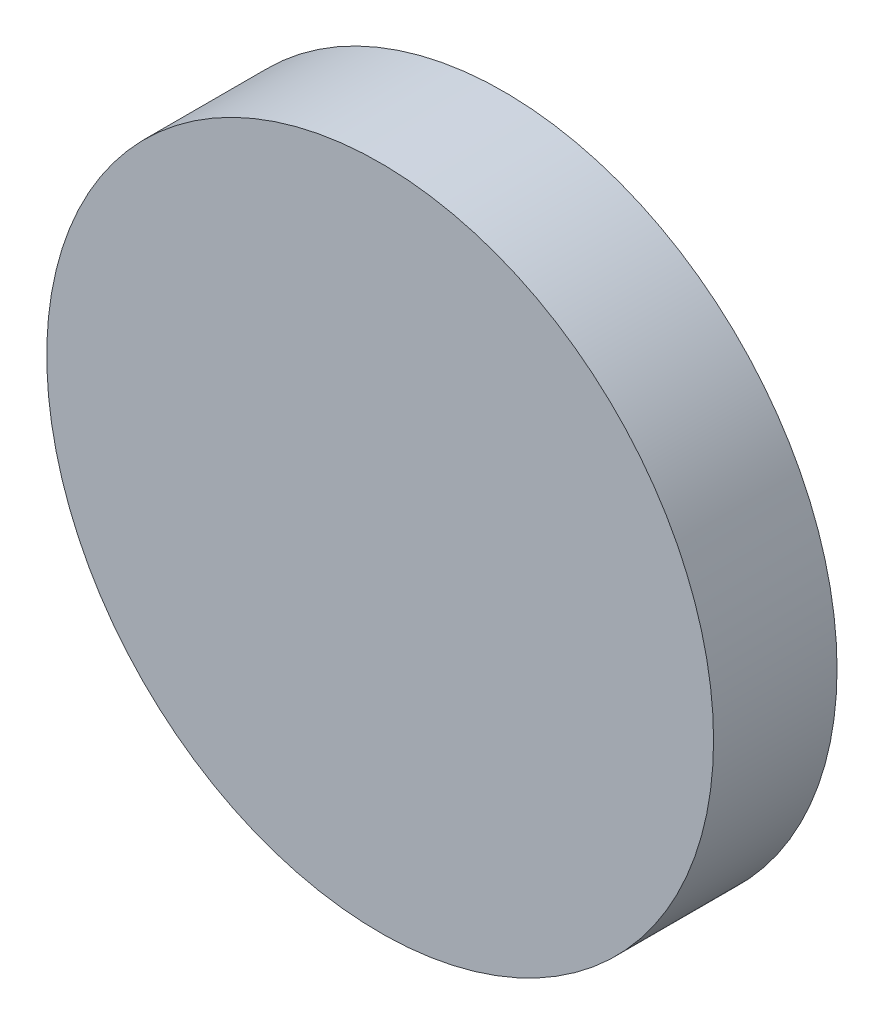
ISO-10303-21;
HEADER;
FILE_DESCRIPTION(('STEP AP214'),'2;1');
FILE_NAME('part.step','',(''),(''),'','','');
FILE_SCHEMA(('AUTOMOTIVE_DESIGN { 1 0 10303 214 1 1 1 1 }'));
ENDSEC;
DATA;
#1=APPLICATION_CONTEXT('core data for automotive mechanical design processes');
#2=APPLICATION_PROTOCOL_DEFINITION('international standard','automotive_design',2000,#1);
#3=PRODUCT_CONTEXT('',#1,'mechanical');
#4=PRODUCT('Part','Part','',(#3));
#5=PRODUCT_RELATED_PRODUCT_CATEGORY('part','',(#4));
#6=PRODUCT_DEFINITION_FORMATION('','',#4);
#7=PRODUCT_DEFINITION_CONTEXT('part definition',#1,'design');
#8=PRODUCT_DEFINITION('design','',#6,#7);
#9=PRODUCT_DEFINITION_SHAPE('','',#8);
#10=(LENGTH_UNIT() NAMED_UNIT(*) SI_UNIT(.MILLI.,.METRE.));
#11=(NAMED_UNIT(*) PLANE_ANGLE_UNIT() SI_UNIT($,.RADIAN.));
#12=(NAMED_UNIT(*) SI_UNIT($,.STERADIAN.) SOLID_ANGLE_UNIT());
#13=UNCERTAINTY_MEASURE_WITH_UNIT(LENGTH_MEASURE(1.E-05),#10,'distance_accuracy_value','');
#14=(GEOMETRIC_REPRESENTATION_CONTEXT(3) GLOBAL_UNCERTAINTY_ASSIGNED_CONTEXT((#13)) GLOBAL_UNIT_ASSIGNED_CONTEXT((#10,
#11,#12)) REPRESENTATION_CONTEXT('',''));
#15=CARTESIAN_POINT('',(0.,0.,0.));
#16=DIRECTION('',(0.,0.,1.));
#17=DIRECTION('',(1.,0.,0.));
#18=AXIS2_PLACEMENT_3D('',#15,#16,#17);
#19=CARTESIAN_POINT('',(0.,0.,5.));
#20=DIRECTION('',(0.,0.,-1.));
#21=DIRECTION('',(-1.,0.,0.));
#22=AXIS2_PLACEMENT_3D('',#19,#20,#21);
#23=CYLINDRICAL_SURFACE('',#22,27.);
#24=CARTESIAN_POINT('',(0.,0.,5.));
#25=DIRECTION('',(0.,0.,1.));
#26=DIRECTION('',(1.,0.,0.));
#27=AXIS2_PLACEMENT_3D('',#24,#25,#26);
#28=CIRCLE('',#27,27.);
#29=CARTESIAN_POINT('',(27.,0.,5.));
#30=VERTEX_POINT('',#29);
#31=EDGE_CURVE('E57',#30,#30,#28,.T.);
#32=ORIENTED_EDGE('',*,*,#31,.F.);
#33=EDGE_LOOP('',(#32));
#34=FACE_BOUND('',#33,.T.);
#35=CARTESIAN_POINT('',(0.,0.,-5.));
#36=DIRECTION('',(0.,0.,1.));
#37=DIRECTION('',(1.,0.,0.));
#38=AXIS2_PLACEMENT_3D('',#35,#36,#37);
#39=CIRCLE('',#38,27.);
#40=CARTESIAN_POINT('',(27.,0.,-5.));
#41=VERTEX_POINT('',#40);
#42=EDGE_CURVE('E49',#41,#41,#39,.T.);
#43=ORIENTED_EDGE('',*,*,#42,.T.);
#44=EDGE_LOOP('',(#43));
#45=FACE_BOUND('',#44,.T.);
#46=ADVANCED_FACE('F50',(#34,#45),#23,.T.);
#47=CARTESIAN_POINT('',(0.,0.,5.));
#48=DIRECTION('',(0.,0.,1.));
#49=DIRECTION('',(1.,0.,0.));
#50=AXIS2_PLACEMENT_3D('',#47,#48,#49);
#51=PLANE('',#50);
#52=ORIENTED_EDGE('',*,*,#31,.T.);
#53=EDGE_LOOP('',(#52));
#54=FACE_BOUND('',#53,.T.);
#55=ADVANCED_FACE('F153',(#54),#51,.T.);
#56=CARTESIAN_POINT('',(0.,0.,-5.));
#57=DIRECTION('',(0.,0.,1.));
#58=DIRECTION('',(1.,0.,0.));
#59=AXIS2_PLACEMENT_3D('',#56,#57,#58);
#60=PLANE('',#59);
#61=CARTESIAN_POINT('',(0.,0.,-5.));
#62=DIRECTION('',(0.,0.,-1.));
#63=DIRECTION('',(-1.,0.,0.));
#64=AXIS2_PLACEMENT_3D('',#61,#62,#63);
#65=CIRCLE('',#64,10.);
#66=CARTESIAN_POINT('',(-10.,0.,-5.));
#67=VERTEX_POINT('',#66);
#68=EDGE_CURVE('E11',#67,#67,#65,.T.);
#69=ORIENTED_EDGE('',*,*,#68,.F.);
#70=EDGE_LOOP('',(#69));
#71=FACE_BOUND('',#70,.T.);
#72=ORIENTED_EDGE('',*,*,#42,.F.);
#73=EDGE_LOOP('',(#72));
#74=FACE_BOUND('',#73,.T.);
#75=ADVANCED_FACE('F151',(#71,#74),#60,.F.);
#76=CARTESIAN_POINT('',(0.,0.,-7.5));
#77=DIRECTION('',(0.,0.,1.));
#78=DIRECTION('',(1.,0.,0.));
#79=AXIS2_PLACEMENT_3D('',#76,#77,#78);
#80=CYLINDRICAL_SURFACE('',#79,10.);
#81=CARTESIAN_POINT('',(0.,0.,-7.5));
#82=DIRECTION('',(0.,0.,-1.));
#83=DIRECTION('',(-1.,0.,0.));
#84=AXIS2_PLACEMENT_3D('',#81,#82,#83);
#85=CIRCLE('',#84,10.);
#86=CARTESIAN_POINT('',(-10.,0.,-7.5));
#87=VERTEX_POINT('',#86);
#88=EDGE_CURVE('E134',#87,#87,#85,.T.);
#89=ORIENTED_EDGE('',*,*,#88,.F.);
#90=EDGE_LOOP('',(#89));
#91=FACE_BOUND('',#90,.T.);
#92=ORIENTED_EDGE('',*,*,#68,.T.);
#93=EDGE_LOOP('',(#92));
#94=FACE_BOUND('',#93,.T.);
#95=ADVANCED_FACE('F152',(#91,#94),#80,.T.);
#96=CARTESIAN_POINT('',(0.,0.,-7.5));
#97=DIRECTION('',(0.,0.,-1.));
#98=DIRECTION('',(-1.,0.,0.));
#99=AXIS2_PLACEMENT_3D('',#96,#97,#98);
#100=PLANE('',#99);
#101=CARTESIAN_POINT('',(0.,0.,-7.5));
#102=DIRECTION('',(0.,0.,-1.));
#103=DIRECTION('',(-1.,0.,0.));
#104=AXIS2_PLACEMENT_3D('',#101,#102,#103);
#105=CIRCLE('',#104,2.725);
#106=CARTESIAN_POINT('',(1.95336248556176,1.9,-7.5));
#107=VERTEX_POINT('',#106);
#108=CARTESIAN_POINT('',(1.95336248556176,-1.9,-7.5));
#109=VERTEX_POINT('',#108);
#110=EDGE_CURVE('E61',#107,#109,#105,.T.);
#111=ORIENTED_EDGE('',*,*,#110,.F.);
#112=DIRECTION('',(1.,0.,0.));
#113=VECTOR('',#112,1.);
#114=CARTESIAN_POINT('',(1.95336248556176,1.9,-7.5));
#115=LINE('',#114,#113);
#116=CARTESIAN_POINT('',(-1.95336248556176,1.9,-7.5));
#117=VERTEX_POINT('',#116);
#118=EDGE_CURVE('E118',#117,#107,#115,.T.);
#119=ORIENTED_EDGE('',*,*,#118,.F.);
#120=CARTESIAN_POINT('',(0.,0.,-7.5));
#121=DIRECTION('',(0.,0.,-1.));
#122=DIRECTION('',(-1.,0.,0.));
#123=AXIS2_PLACEMENT_3D('',#120,#121,#122);
#124=CIRCLE('',#123,2.725);
#125=CARTESIAN_POINT('',(-1.95336248556176,-1.9,-7.5));
#126=VERTEX_POINT('',#125);
#127=EDGE_CURVE('E129',#126,#117,#124,.T.);
#128=ORIENTED_EDGE('',*,*,#127,.F.);
#129=DIRECTION('',(-1.,0.,0.));
#130=VECTOR('',#129,1.);
#131=CARTESIAN_POINT('',(1.95336248556176,-1.9,-7.5));
#132=LINE('',#131,#130);
#133=EDGE_CURVE('E100',#109,#126,#132,.T.);
#134=ORIENTED_EDGE('',*,*,#133,.F.);
#135=EDGE_LOOP('',(#111,#119,#128,#134));
#136=FACE_BOUND('',#135,.T.);
#137=ORIENTED_EDGE('',*,*,#88,.T.);
#138=EDGE_LOOP('',(#137));
#139=FACE_BOUND('',#138,.T.);
#140=ADVANCED_FACE('F159',(#136,#139),#100,.T.);
#141=CARTESIAN_POINT('',(0.,0.,1.5));
#142=DIRECTION('',(0.,0.,-1.));
#143=DIRECTION('',(-1.,0.,0.));
#144=AXIS2_PLACEMENT_3D('',#141,#142,#143);
#145=CYLINDRICAL_SURFACE('',#144,2.725);
#146=ORIENTED_EDGE('',*,*,#110,.T.);
#147=DIRECTION('',(0.,0.,-1.));
#148=VECTOR('',#147,1.);
#149=CARTESIAN_POINT('',(1.95336248556176,-1.9,1.5));
#150=LINE('',#149,#148);
#151=CARTESIAN_POINT('',(1.95336248556176,-1.9,1.5));
#152=VERTEX_POINT('',#151);
#153=EDGE_CURVE('E90',#152,#109,#150,.T.);
#154=ORIENTED_EDGE('',*,*,#153,.F.);
#155=CARTESIAN_POINT('',(0.,0.,1.5));
#156=DIRECTION('',(0.,0.,-1.));
#157=DIRECTION('',(-1.,0.,0.));
#158=AXIS2_PLACEMENT_3D('',#155,#156,#157);
#159=CIRCLE('',#158,2.725);
#160=CARTESIAN_POINT('',(1.95336248556176,1.9,1.5));
#161=VERTEX_POINT('',#160);
#162=EDGE_CURVE('E114',#161,#152,#159,.T.);
#163=ORIENTED_EDGE('',*,*,#162,.F.);
#164=DIRECTION('',(0.,0.,-1.));
#165=VECTOR('',#164,1.);
#166=CARTESIAN_POINT('',(1.95336248556176,1.9,1.5));
#167=LINE('',#166,#165);
#168=EDGE_CURVE('E75',#161,#107,#167,.T.);
#169=ORIENTED_EDGE('',*,*,#168,.T.);
#170=EDGE_LOOP('',(#146,#154,#163,#169));
#171=FACE_BOUND('',#170,.T.);
#172=ADVANCED_FACE('F195',(#171),#145,.F.);
#173=CARTESIAN_POINT('',(1.95336248556176,1.9,1.5));
#174=DIRECTION('',(0.,1.,0.));
#175=DIRECTION('',(0.,0.,1.));
#176=AXIS2_PLACEMENT_3D('',#173,#174,#175);
#177=PLANE('',#176);
#178=ORIENTED_EDGE('',*,*,#118,.T.);
#179=ORIENTED_EDGE('',*,*,#168,.F.);
#180=DIRECTION('',(1.,0.,0.));
#181=VECTOR('',#180,1.);
#182=CARTESIAN_POINT('',(1.95336248556176,1.9,1.5));
#183=LINE('',#182,#181);
#184=CARTESIAN_POINT('',(-1.95336248556176,1.9,1.5));
#185=VERTEX_POINT('',#184);
#186=EDGE_CURVE('E115',#185,#161,#183,.T.);
#187=ORIENTED_EDGE('',*,*,#186,.F.);
#188=DIRECTION('',(0.,0.,-1.));
#189=VECTOR('',#188,1.);
#190=CARTESIAN_POINT('',(-1.95336248556176,1.9,1.5));
#191=LINE('',#190,#189);
#192=EDGE_CURVE('E104',#185,#117,#191,.T.);
#193=ORIENTED_EDGE('',*,*,#192,.T.);
#194=EDGE_LOOP('',(#178,#179,#187,#193));
#195=FACE_BOUND('',#194,.T.);
#196=ADVANCED_FACE('F201',(#195),#177,.F.);
#197=CARTESIAN_POINT('',(0.,0.,1.5));
#198=DIRECTION('',(0.,0.,-1.));
#199=DIRECTION('',(-1.,0.,0.));
#200=AXIS2_PLACEMENT_3D('',#197,#198,#199);
#201=CYLINDRICAL_SURFACE('',#200,2.725);
#202=ORIENTED_EDGE('',*,*,#127,.T.);
#203=ORIENTED_EDGE('',*,*,#192,.F.);
#204=CARTESIAN_POINT('',(0.,0.,1.5));
#205=DIRECTION('',(0.,0.,-1.));
#206=DIRECTION('',(-1.,0.,0.));
#207=AXIS2_PLACEMENT_3D('',#204,#205,#206);
#208=CIRCLE('',#207,2.725);
#209=CARTESIAN_POINT('',(-1.95336248556176,-1.9,1.5));
#210=VERTEX_POINT('',#209);
#211=EDGE_CURVE('E110',#210,#185,#208,.T.);
#212=ORIENTED_EDGE('',*,*,#211,.F.);
#213=DIRECTION('',(0.,0.,-1.));
#214=VECTOR('',#213,1.);
#215=CARTESIAN_POINT('',(-1.95336248556176,-1.9,1.5));
#216=LINE('',#215,#214);
#217=EDGE_CURVE('E95',#210,#126,#216,.T.);
#218=ORIENTED_EDGE('',*,*,#217,.T.);
#219=EDGE_LOOP('',(#202,#203,#212,#218));
#220=FACE_BOUND('',#219,.T.);
#221=ADVANCED_FACE('F108',(#220),#201,.F.);
#222=CARTESIAN_POINT('',(1.95336248556176,-1.9,1.5));
#223=DIRECTION('',(0.,-1.,0.));
#224=DIRECTION('',(0.,0.,-1.));
#225=AXIS2_PLACEMENT_3D('',#222,#223,#224);
#226=PLANE('',#225);
#227=ORIENTED_EDGE('',*,*,#133,.T.);
#228=ORIENTED_EDGE('',*,*,#217,.F.);
#229=DIRECTION('',(-1.,0.,0.));
#230=VECTOR('',#229,1.);
#231=CARTESIAN_POINT('',(1.95336248556176,-1.9,1.5));
#232=LINE('',#231,#230);
#233=EDGE_CURVE('E98',#152,#210,#232,.T.);
#234=ORIENTED_EDGE('',*,*,#233,.F.);
#235=ORIENTED_EDGE('',*,*,#153,.T.);
#236=EDGE_LOOP('',(#227,#228,#234,#235));
#237=FACE_BOUND('',#236,.T.);
#238=ADVANCED_FACE('F92',(#237),#226,.F.);
#239=CARTESIAN_POINT('',(0.,0.,1.5));
#240=DIRECTION('',(0.,0.,-1.));
#241=DIRECTION('',(-1.,0.,0.));
#242=AXIS2_PLACEMENT_3D('',#239,#240,#241);
#243=PLANE('',#242);
#244=ORIENTED_EDGE('',*,*,#162,.T.);
#245=ORIENTED_EDGE('',*,*,#233,.T.);
#246=ORIENTED_EDGE('',*,*,#211,.T.);
#247=ORIENTED_EDGE('',*,*,#186,.T.);
#248=EDGE_LOOP('',(#244,#245,#246,#247));
#249=FACE_BOUND('',#248,.T.);
#250=ADVANCED_FACE('F112',(#249),#243,.T.);
#251=CLOSED_SHELL('',(#46,#55,#75,#95,#140,#172,#196,#221,#238,#250));
#252=MANIFOLD_SOLID_BREP('B2',#251);
#253=ADVANCED_BREP_SHAPE_REPRESENTATION('',(#18,#252),#14);
#254=SHAPE_DEFINITION_REPRESENTATION(#9,#253);
ENDSEC;
END-ISO-10303-21;
